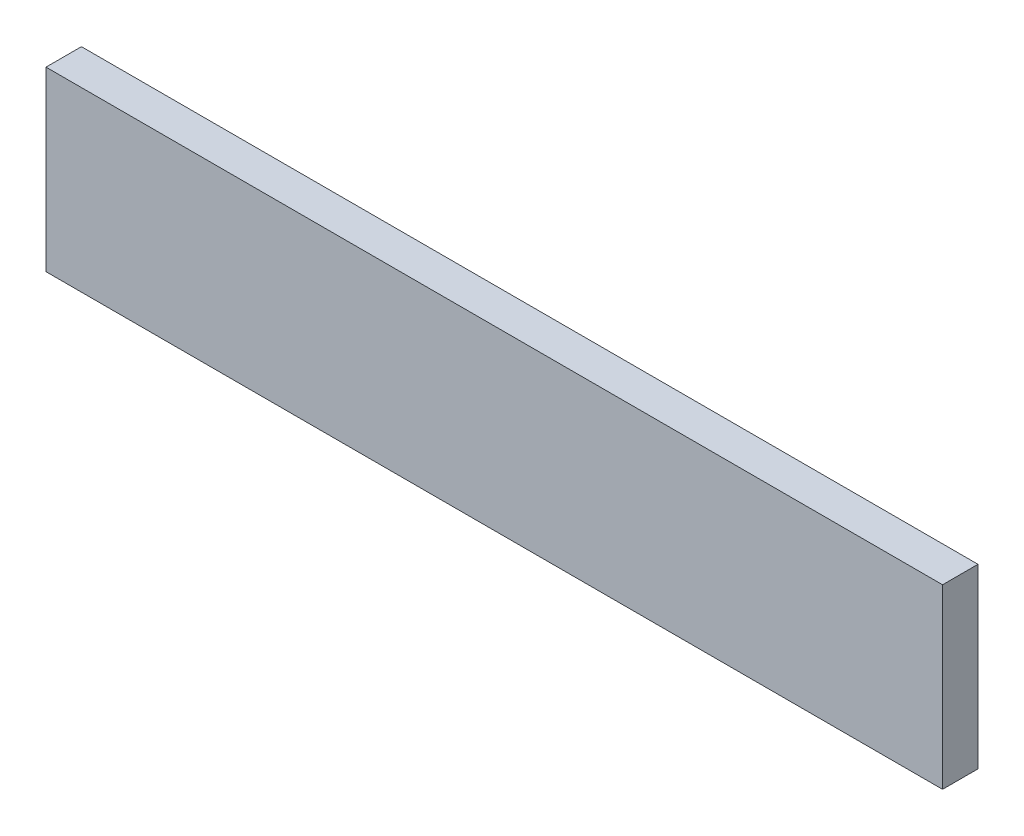
ISO-10303-21;
HEADER;
FILE_DESCRIPTION(('STEP AP214'),'2;1');
FILE_NAME('part.step','',(''),(''),'','','');
FILE_SCHEMA(('AUTOMOTIVE_DESIGN { 1 0 10303 214 1 1 1 1 }'));
ENDSEC;
DATA;
#1=APPLICATION_CONTEXT('core data for automotive mechanical design processes');
#2=APPLICATION_PROTOCOL_DEFINITION('international standard','automotive_design',2000,#1);
#3=PRODUCT_CONTEXT('',#1,'mechanical');
#4=PRODUCT('Part','Part','',(#3));
#5=PRODUCT_RELATED_PRODUCT_CATEGORY('part','',(#4));
#6=PRODUCT_DEFINITION_FORMATION('','',#4);
#7=PRODUCT_DEFINITION_CONTEXT('part definition',#1,'design');
#8=PRODUCT_DEFINITION('design','',#6,#7);
#9=PRODUCT_DEFINITION_SHAPE('','',#8);
#10=(LENGTH_UNIT() NAMED_UNIT(*) SI_UNIT(.MILLI.,.METRE.));
#11=(NAMED_UNIT(*) PLANE_ANGLE_UNIT() SI_UNIT($,.RADIAN.));
#12=(NAMED_UNIT(*) SI_UNIT($,.STERADIAN.) SOLID_ANGLE_UNIT());
#13=UNCERTAINTY_MEASURE_WITH_UNIT(LENGTH_MEASURE(1.E-05),#10,'distance_accuracy_value','');
#14=(GEOMETRIC_REPRESENTATION_CONTEXT(3) GLOBAL_UNCERTAINTY_ASSIGNED_CONTEXT((#13)) GLOBAL_UNIT_ASSIGNED_CONTEXT((#10,
#11,#12)) REPRESENTATION_CONTEXT('',''));
#15=CARTESIAN_POINT('',(0.,0.,0.));
#16=DIRECTION('',(0.,0.,1.));
#17=DIRECTION('',(1.,0.,0.));
#18=AXIS2_PLACEMENT_3D('',#15,#16,#17);
#19=CARTESIAN_POINT('',(0.,0.,20.));
#20=DIRECTION('',(1.,0.,0.));
#21=DIRECTION('',(0.,0.,-1.));
#22=AXIS2_PLACEMENT_3D('',#19,#20,#21);
#23=PLANE('',#22);
#24=DIRECTION('',(0.,-1.,0.));
#25=VECTOR('',#24,1.);
#26=CARTESIAN_POINT('',(0.,0.,0.));
#27=LINE('',#26,#25);
#28=CARTESIAN_POINT('',(0.,100.,0.));
#29=VERTEX_POINT('',#28);
#30=CARTESIAN_POINT('',(0.,0.,0.));
#31=VERTEX_POINT('',#30);
#32=EDGE_CURVE('E96',#29,#31,#27,.T.);
#33=ORIENTED_EDGE('',*,*,#32,.T.);
#34=DIRECTION('',(0.,0.,-1.));
#35=VECTOR('',#34,1.);
#36=CARTESIAN_POINT('',(0.,0.,20.));
#37=LINE('',#36,#35);
#38=CARTESIAN_POINT('',(0.,0.,20.));
#39=VERTEX_POINT('',#38);
#40=EDGE_CURVE('E11',#39,#31,#37,.T.);
#41=ORIENTED_EDGE('',*,*,#40,.F.);
#42=DIRECTION('',(0.,-1.,0.));
#43=VECTOR('',#42,1.);
#44=CARTESIAN_POINT('',(0.,0.,20.));
#45=LINE('',#44,#43);
#46=CARTESIAN_POINT('',(0.,100.,20.));
#47=VERTEX_POINT('',#46);
#48=EDGE_CURVE('E84',#47,#39,#45,.T.);
#49=ORIENTED_EDGE('',*,*,#48,.F.);
#50=DIRECTION('',(0.,0.,-1.));
#51=VECTOR('',#50,1.);
#52=CARTESIAN_POINT('',(0.,100.,20.));
#53=LINE('',#52,#51);
#54=EDGE_CURVE('E92',#47,#29,#53,.T.);
#55=ORIENTED_EDGE('',*,*,#54,.T.);
#56=EDGE_LOOP('',(#33,#41,#49,#55));
#57=FACE_BOUND('',#56,.T.);
#58=ADVANCED_FACE('F33',(#57),#23,.F.);
#59=CARTESIAN_POINT('',(0.,0.,20.));
#60=DIRECTION('',(0.,1.,0.));
#61=DIRECTION('',(0.,0.,1.));
#62=AXIS2_PLACEMENT_3D('',#59,#60,#61);
#63=PLANE('',#62);
#64=DIRECTION('',(1.,0.,0.));
#65=VECTOR('',#64,1.);
#66=CARTESIAN_POINT('',(0.,0.,0.));
#67=LINE('',#66,#65);
#68=CARTESIAN_POINT('',(506.,0.,0.));
#69=VERTEX_POINT('',#68);
#70=EDGE_CURVE('E88',#31,#69,#67,.T.);
#71=ORIENTED_EDGE('',*,*,#70,.T.);
#72=DIRECTION('',(0.,0.,-1.));
#73=VECTOR('',#72,1.);
#74=CARTESIAN_POINT('',(506.,0.,20.));
#75=LINE('',#74,#73);
#76=CARTESIAN_POINT('',(506.,0.,20.));
#77=VERTEX_POINT('',#76);
#78=EDGE_CURVE('E41',#77,#69,#75,.T.);
#79=ORIENTED_EDGE('',*,*,#78,.F.);
#80=DIRECTION('',(1.,0.,0.));
#81=VECTOR('',#80,1.);
#82=CARTESIAN_POINT('',(0.,0.,20.));
#83=LINE('',#82,#81);
#84=EDGE_CURVE('E79',#39,#77,#83,.T.);
#85=ORIENTED_EDGE('',*,*,#84,.F.);
#86=ORIENTED_EDGE('',*,*,#40,.T.);
#87=EDGE_LOOP('',(#71,#79,#85,#86));
#88=FACE_BOUND('',#87,.T.);
#89=ADVANCED_FACE('F87',(#88),#63,.F.);
#90=CARTESIAN_POINT('',(506.,0.,20.));
#91=DIRECTION('',(-1.,0.,0.));
#92=DIRECTION('',(0.,0.,1.));
#93=AXIS2_PLACEMENT_3D('',#90,#91,#92);
#94=PLANE('',#93);
#95=DIRECTION('',(0.,1.,0.));
#96=VECTOR('',#95,1.);
#97=CARTESIAN_POINT('',(506.,0.,0.));
#98=LINE('',#97,#96);
#99=CARTESIAN_POINT('',(506.,100.,0.));
#100=VERTEX_POINT('',#99);
#101=EDGE_CURVE('E66',#69,#100,#98,.T.);
#102=ORIENTED_EDGE('',*,*,#101,.T.);
#103=DIRECTION('',(0.,0.,-1.));
#104=VECTOR('',#103,1.);
#105=CARTESIAN_POINT('',(506.,100.,20.));
#106=LINE('',#105,#104);
#107=CARTESIAN_POINT('',(506.,100.,20.));
#108=VERTEX_POINT('',#107);
#109=EDGE_CURVE('E89',#108,#100,#106,.T.);
#110=ORIENTED_EDGE('',*,*,#109,.F.);
#111=DIRECTION('',(0.,1.,0.));
#112=VECTOR('',#111,1.);
#113=CARTESIAN_POINT('',(506.,0.,20.));
#114=LINE('',#113,#112);
#115=EDGE_CURVE('E82',#77,#108,#114,.T.);
#116=ORIENTED_EDGE('',*,*,#115,.F.);
#117=ORIENTED_EDGE('',*,*,#78,.T.);
#118=EDGE_LOOP('',(#102,#110,#116,#117));
#119=FACE_BOUND('',#118,.T.);
#120=ADVANCED_FACE('F90',(#119),#94,.F.);
#121=CARTESIAN_POINT('',(0.,100.,20.));
#122=DIRECTION('',(0.,-1.,0.));
#123=DIRECTION('',(0.,0.,-1.));
#124=AXIS2_PLACEMENT_3D('',#121,#122,#123);
#125=PLANE('',#124);
#126=DIRECTION('',(-1.,0.,0.));
#127=VECTOR('',#126,1.);
#128=CARTESIAN_POINT('',(0.,100.,0.));
#129=LINE('',#128,#127);
#130=EDGE_CURVE('E72',#100,#29,#129,.T.);
#131=ORIENTED_EDGE('',*,*,#130,.T.);
#132=ORIENTED_EDGE('',*,*,#54,.F.);
#133=DIRECTION('',(-1.,0.,0.));
#134=VECTOR('',#133,1.);
#135=CARTESIAN_POINT('',(0.,100.,20.));
#136=LINE('',#135,#134);
#137=EDGE_CURVE('E49',#108,#47,#136,.T.);
#138=ORIENTED_EDGE('',*,*,#137,.F.);
#139=ORIENTED_EDGE('',*,*,#109,.T.);
#140=EDGE_LOOP('',(#131,#132,#138,#139));
#141=FACE_BOUND('',#140,.T.);
#142=ADVANCED_FACE('F103',(#141),#125,.F.);
#143=CARTESIAN_POINT('',(0.,0.,20.));
#144=DIRECTION('',(0.,0.,-1.));
#145=DIRECTION('',(-1.,0.,0.));
#146=AXIS2_PLACEMENT_3D('',#143,#144,#145);
#147=PLANE('',#146);
#148=ORIENTED_EDGE('',*,*,#48,.T.);
#149=ORIENTED_EDGE('',*,*,#84,.T.);
#150=ORIENTED_EDGE('',*,*,#115,.T.);
#151=ORIENTED_EDGE('',*,*,#137,.T.);
#152=EDGE_LOOP('',(#148,#149,#150,#151));
#153=FACE_BOUND('',#152,.T.);
#154=ADVANCED_FACE('F80',(#153),#147,.F.);
#155=CARTESIAN_POINT('',(0.,0.,0.));
#156=DIRECTION('',(0.,0.,-1.));
#157=DIRECTION('',(-1.,0.,0.));
#158=AXIS2_PLACEMENT_3D('',#155,#156,#157);
#159=PLANE('',#158);
#160=ORIENTED_EDGE('',*,*,#32,.F.);
#161=ORIENTED_EDGE('',*,*,#130,.F.);
#162=ORIENTED_EDGE('',*,*,#101,.F.);
#163=ORIENTED_EDGE('',*,*,#70,.F.);
#164=EDGE_LOOP('',(#160,#161,#162,#163));
#165=FACE_BOUND('',#164,.T.);
#166=ADVANCED_FACE('F106',(#165),#159,.T.);
#167=CLOSED_SHELL('',(#58,#89,#120,#142,#154,#166));
#168=MANIFOLD_SOLID_BREP('B2',#167);
#169=ADVANCED_BREP_SHAPE_REPRESENTATION('',(#18,#168),#14);
#170=SHAPE_DEFINITION_REPRESENTATION(#9,#169);
ENDSEC;
END-ISO-10303-21;
